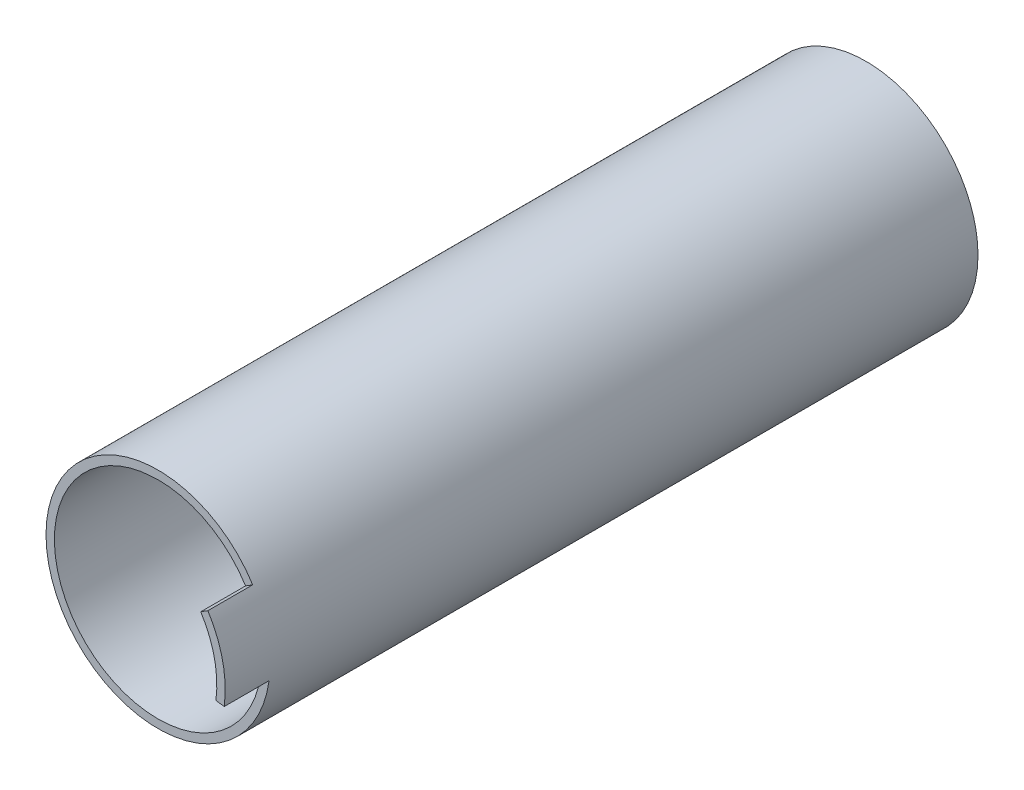
ISO-10303-21;
HEADER;
FILE_DESCRIPTION(('STEP AP214'),'2;1');
FILE_NAME('part.step','',(''),(''),'','','');
FILE_SCHEMA(('AUTOMOTIVE_DESIGN { 1 0 10303 214 1 1 1 1 }'));
ENDSEC;
DATA;
#1=APPLICATION_CONTEXT('core data for automotive mechanical design processes');
#2=APPLICATION_PROTOCOL_DEFINITION('international standard','automotive_design',2000,#1);
#3=PRODUCT_CONTEXT('',#1,'mechanical');
#4=PRODUCT('Part','Part','',(#3));
#5=PRODUCT_RELATED_PRODUCT_CATEGORY('part','',(#4));
#6=PRODUCT_DEFINITION_FORMATION('','',#4);
#7=PRODUCT_DEFINITION_CONTEXT('part definition',#1,'design');
#8=PRODUCT_DEFINITION('design','',#6,#7);
#9=PRODUCT_DEFINITION_SHAPE('','',#8);
#10=(LENGTH_UNIT() NAMED_UNIT(*) SI_UNIT(.MILLI.,.METRE.));
#11=(NAMED_UNIT(*) PLANE_ANGLE_UNIT() SI_UNIT($,.RADIAN.));
#12=(NAMED_UNIT(*) SI_UNIT($,.STERADIAN.) SOLID_ANGLE_UNIT());
#13=UNCERTAINTY_MEASURE_WITH_UNIT(LENGTH_MEASURE(1.E-05),#10,'distance_accuracy_value','');
#14=(GEOMETRIC_REPRESENTATION_CONTEXT(3) GLOBAL_UNCERTAINTY_ASSIGNED_CONTEXT((#13)) GLOBAL_UNIT_ASSIGNED_CONTEXT((#10,
#11,#12)) REPRESENTATION_CONTEXT('',''));
#15=CARTESIAN_POINT('',(0.,0.,0.));
#16=DIRECTION('',(0.,0.,1.));
#17=DIRECTION('',(1.,0.,0.));
#18=AXIS2_PLACEMENT_3D('',#15,#16,#17);
#19=CARTESIAN_POINT('',(0.,0.,0.));
#20=DIRECTION('',(0.,0.,-1.));
#21=DIRECTION('',(-1.,0.,0.));
#22=AXIS2_PLACEMENT_3D('',#19,#20,#21);
#23=PLANE('',#22);
#24=CARTESIAN_POINT('',(0.,0.,0.));
#25=DIRECTION('',(0.,0.,1.));
#26=DIRECTION('',(-1.,0.,0.));
#27=AXIS2_PLACEMENT_3D('',#24,#25,#26);
#28=CIRCLE('',#27,5.);
#29=CARTESIAN_POINT('',(-5.,0.,0.));
#30=VERTEX_POINT('',#29);
#31=CARTESIAN_POINT('',(5.,0.,0.));
#32=VERTEX_POINT('',#31);
#33=EDGE_CURVE('E104',#30,#32,#28,.T.);
#34=ORIENTED_EDGE('',*,*,#33,.F.);
#35=DIRECTION('',(0.,-1.,0.));
#36=VECTOR('',#35,1.);
#37=CARTESIAN_POINT('',(-5.,0.,0.));
#38=LINE('',#37,#36);
#39=CARTESIAN_POINT('',(-5.,16.7705098312484,0.));
#40=VERTEX_POINT('',#39);
#41=EDGE_CURVE('E58',#40,#30,#38,.T.);
#42=ORIENTED_EDGE('',*,*,#41,.F.);
#43=CARTESIAN_POINT('',(0.,0.,0.));
#44=DIRECTION('',(0.,0.,1.));
#45=DIRECTION('',(1.,0.,0.));
#46=AXIS2_PLACEMENT_3D('',#43,#44,#45);
#47=CIRCLE('',#46,17.5);
#48=CARTESIAN_POINT('',(5.,16.7705098312484,0.));
#49=VERTEX_POINT('',#48);
#50=EDGE_CURVE('E105',#49,#40,#47,.T.);
#51=ORIENTED_EDGE('',*,*,#50,.F.);
#52=DIRECTION('',(0.,1.,0.));
#53=VECTOR('',#52,1.);
#54=CARTESIAN_POINT('',(5.,0.,0.));
#55=LINE('',#54,#53);
#56=EDGE_CURVE('E94',#32,#49,#55,.T.);
#57=ORIENTED_EDGE('',*,*,#56,.F.);
#58=EDGE_LOOP('',(#34,#42,#51,#57));
#59=FACE_BOUND('',#58,.T.);
#60=CARTESIAN_POINT('',(0.,0.,0.));
#61=DIRECTION('',(0.,0.,1.));
#62=DIRECTION('',(1.,0.,0.));
#63=AXIS2_PLACEMENT_3D('',#60,#61,#62);
#64=CIRCLE('',#63,2.99999999999862);
#65=CARTESIAN_POINT('',(-2.99999999999862,0.,0.));
#66=VERTEX_POINT('',#65);
#67=EDGE_CURVE('E117',#66,#66,#64,.T.);
#68=ORIENTED_EDGE('',*,*,#67,.T.);
#69=EDGE_LOOP('',(#68));
#70=FACE_BOUND('',#69,.T.);
#71=ADVANCED_FACE('F49',(#59,#70),#23,.T.);
#72=CARTESIAN_POINT('',(0.,0.,83.6221445044903));
#73=DIRECTION('',(0.,0.,-1.));
#74=DIRECTION('',(-1.,0.,0.));
#75=AXIS2_PLACEMENT_3D('',#72,#73,#74);
#76=CYLINDRICAL_SURFACE('',#75,5.);
#77=DIRECTION('',(0.,0.,-1.));
#78=VECTOR('',#77,1.);
#79=CARTESIAN_POINT('',(5.,0.,83.6221445044903));
#80=LINE('',#79,#78);
#81=CARTESIAN_POINT('',(5.,0.,58.6));
#82=VERTEX_POINT('',#81);
#83=EDGE_CURVE('E91',#82,#32,#80,.T.);
#84=ORIENTED_EDGE('',*,*,#83,.F.);
#85=CARTESIAN_POINT('',(0.,0.,58.6));
#86=DIRECTION('',(0.,0.,-1.));
#87=DIRECTION('',(-1.,0.,0.));
#88=AXIS2_PLACEMENT_3D('',#85,#86,#87);
#89=CIRCLE('',#88,5.);
#90=CARTESIAN_POINT('',(-5.,0.,58.6));
#91=VERTEX_POINT('',#90);
#92=EDGE_CURVE('E66',#82,#91,#89,.T.);
#93=ORIENTED_EDGE('',*,*,#92,.T.);
#94=DIRECTION('',(0.,0.,-1.));
#95=VECTOR('',#94,1.);
#96=CARTESIAN_POINT('',(-5.,0.,83.6221445044903));
#97=LINE('',#96,#95);
#98=EDGE_CURVE('E110',#91,#30,#97,.T.);
#99=ORIENTED_EDGE('',*,*,#98,.T.);
#100=ORIENTED_EDGE('',*,*,#33,.T.);
#101=EDGE_LOOP('',(#84,#93,#99,#100));
#102=FACE_BOUND('',#101,.T.);
#103=ADVANCED_FACE('F108',(#102),#76,.T.);
#104=CARTESIAN_POINT('',(5.,0.,83.6221445044903));
#105=DIRECTION('',(-1.,0.,0.));
#106=DIRECTION('',(0.,-1.,0.));
#107=AXIS2_PLACEMENT_3D('',#104,#105,#106);
#108=PLANE('',#107);
#109=DIRECTION('',(0.,0.,-1.));
#110=VECTOR('',#109,1.);
#111=CARTESIAN_POINT('',(5.,16.7705098312484,83.6221445044903));
#112=LINE('',#111,#110);
#113=CARTESIAN_POINT('',(5.,16.7705098312484,58.6));
#114=VERTEX_POINT('',#113);
#115=EDGE_CURVE('E86',#114,#49,#112,.T.);
#116=ORIENTED_EDGE('',*,*,#115,.F.);
#117=DIRECTION('',(0.,-1.,0.));
#118=VECTOR('',#117,1.);
#119=CARTESIAN_POINT('',(5.,0.,58.6));
#120=LINE('',#119,#118);
#121=EDGE_CURVE('E96',#114,#82,#120,.T.);
#122=ORIENTED_EDGE('',*,*,#121,.T.);
#123=ORIENTED_EDGE('',*,*,#83,.T.);
#124=ORIENTED_EDGE('',*,*,#56,.T.);
#125=EDGE_LOOP('',(#116,#122,#123,#124));
#126=FACE_BOUND('',#125,.T.);
#127=ADVANCED_FACE('F93',(#126),#108,.F.);
#128=CARTESIAN_POINT('',(0.,0.,83.6221445044903));
#129=DIRECTION('',(0.,0.,-1.));
#130=DIRECTION('',(-1.,0.,0.));
#131=AXIS2_PLACEMENT_3D('',#128,#129,#130);
#132=CYLINDRICAL_SURFACE('',#131,17.5);
#133=DIRECTION('',(0.,0.,-1.));
#134=VECTOR('',#133,1.);
#135=CARTESIAN_POINT('',(-5.,16.7705098312484,83.6221445044903));
#136=LINE('',#135,#134);
#137=CARTESIAN_POINT('',(-5.,16.7705098312484,58.6));
#138=VERTEX_POINT('',#137);
#139=EDGE_CURVE('E121',#138,#40,#136,.T.);
#140=ORIENTED_EDGE('',*,*,#139,.F.);
#141=CARTESIAN_POINT('',(0.,0.,58.6));
#142=DIRECTION('',(0.,0.,-1.));
#143=DIRECTION('',(-1.,0.,0.));
#144=AXIS2_PLACEMENT_3D('',#141,#142,#143);
#145=CIRCLE('',#144,17.5);
#146=EDGE_CURVE('E106',#138,#114,#145,.T.);
#147=ORIENTED_EDGE('',*,*,#146,.T.);
#148=ORIENTED_EDGE('',*,*,#115,.T.);
#149=ORIENTED_EDGE('',*,*,#50,.T.);
#150=EDGE_LOOP('',(#140,#147,#148,#149));
#151=FACE_BOUND('',#150,.T.);
#152=ADVANCED_FACE('F130',(#151),#132,.T.);
#153=CARTESIAN_POINT('',(-5.,0.,83.6221445044903));
#154=DIRECTION('',(1.,0.,0.));
#155=DIRECTION('',(0.,1.,0.));
#156=AXIS2_PLACEMENT_3D('',#153,#154,#155);
#157=PLANE('',#156);
#158=ORIENTED_EDGE('',*,*,#98,.F.);
#159=DIRECTION('',(0.,1.,0.));
#160=VECTOR('',#159,1.);
#161=CARTESIAN_POINT('',(-5.,0.,58.6));
#162=LINE('',#161,#160);
#163=EDGE_CURVE('E122',#91,#138,#162,.T.);
#164=ORIENTED_EDGE('',*,*,#163,.T.);
#165=ORIENTED_EDGE('',*,*,#139,.T.);
#166=ORIENTED_EDGE('',*,*,#41,.T.);
#167=EDGE_LOOP('',(#158,#164,#165,#166));
#168=FACE_BOUND('',#167,.T.);
#169=ADVANCED_FACE('F129',(#168),#157,.F.);
#170=CARTESIAN_POINT('',(0.,0.,83.6221445044903));
#171=DIRECTION('',(0.,0.,-1.));
#172=DIRECTION('',(-1.,0.,0.));
#173=AXIS2_PLACEMENT_3D('',#170,#171,#172);
#174=CYLINDRICAL_SURFACE('',#173,2.99999999999862);
#175=CARTESIAN_POINT('',(0.,0.,58.6));
#176=DIRECTION('',(0.,0.,-1.));
#177=DIRECTION('',(-1.,0.,0.));
#178=AXIS2_PLACEMENT_3D('',#175,#176,#177);
#179=CIRCLE('',#178,2.99999999999862);
#180=CARTESIAN_POINT('',(-2.99999999999862,0.,58.6));
#181=VERTEX_POINT('',#180);
#182=EDGE_CURVE('E13',#181,#181,#179,.T.);
#183=CARTESIAN_POINT('',(-2.99999999999862,0.,58.6));
#184=CARTESIAN_POINT('',(-2.99999999999862,0.,57.9895833333333));
#185=CARTESIAN_POINT('',(-2.99999999999862,0.,57.3791666666667));
#186=CARTESIAN_POINT('',(-2.99999999999862,0.,56.1583333333333));
#187=CARTESIAN_POINT('',(-2.99999999999862,0.,55.5479166666667));
#188=CARTESIAN_POINT('',(-2.99999999999862,0.,54.3270833333333));
#189=CARTESIAN_POINT('',(-2.99999999999862,0.,53.7166666666667));
#190=CARTESIAN_POINT('',(-2.99999999999862,0.,52.4958333333333));
#191=CARTESIAN_POINT('',(-2.99999999999862,0.,51.8854166666667));
#192=CARTESIAN_POINT('',(-2.99999999999862,0.,50.6645833333333));
#193=CARTESIAN_POINT('',(-2.99999999999862,0.,50.0541666666667));
#194=CARTESIAN_POINT('',(-2.99999999999862,0.,48.8333333333333));
#195=CARTESIAN_POINT('',(-2.99999999999862,0.,48.2229166666667));
#196=CARTESIAN_POINT('',(-2.99999999999862,0.,47.0020833333333));
#197=CARTESIAN_POINT('',(-2.99999999999862,0.,46.3916666666667));
#198=CARTESIAN_POINT('',(-2.99999999999862,0.,45.1708333333333));
#199=CARTESIAN_POINT('',(-2.99999999999862,0.,44.5604166666667));
#200=CARTESIAN_POINT('',(-2.99999999999862,0.,43.3395833333333));
#201=CARTESIAN_POINT('',(-2.99999999999862,0.,42.7291666666667));
#202=CARTESIAN_POINT('',(-2.99999999999862,0.,41.5083333333333));
#203=CARTESIAN_POINT('',(-2.99999999999862,0.,40.8979166666667));
#204=CARTESIAN_POINT('',(-2.99999999999862,0.,39.6770833333333));
#205=CARTESIAN_POINT('',(-2.99999999999862,0.,39.0666666666667));
#206=CARTESIAN_POINT('',(-2.99999999999862,0.,37.8458333333333));
#207=CARTESIAN_POINT('',(-2.99999999999862,0.,37.2354166666667));
#208=CARTESIAN_POINT('',(-2.99999999999862,0.,36.0145833333333));
#209=CARTESIAN_POINT('',(-2.99999999999862,0.,35.4041666666667));
#210=CARTESIAN_POINT('',(-2.99999999999862,0.,34.1833333333333));
#211=CARTESIAN_POINT('',(-2.99999999999862,0.,33.5729166666667));
#212=CARTESIAN_POINT('',(-2.99999999999862,0.,32.3520833333333));
#213=CARTESIAN_POINT('',(-2.99999999999862,0.,31.7416666666667));
#214=CARTESIAN_POINT('',(-2.99999999999862,0.,30.5208333333333));
#215=CARTESIAN_POINT('',(-2.99999999999862,0.,29.9104166666667));
#216=CARTESIAN_POINT('',(-2.99999999999862,0.,28.6895833333333));
#217=CARTESIAN_POINT('',(-2.99999999999862,0.,28.0791666666667));
#218=CARTESIAN_POINT('',(-2.99999999999862,0.,26.8583333333333));
#219=CARTESIAN_POINT('',(-2.99999999999862,0.,26.2479166666667));
#220=CARTESIAN_POINT('',(-2.99999999999862,0.,25.0270833333333));
#221=CARTESIAN_POINT('',(-2.99999999999862,0.,24.4166666666667));
#222=CARTESIAN_POINT('',(-2.99999999999862,0.,23.1958333333333));
#223=CARTESIAN_POINT('',(-2.99999999999862,0.,22.5854166666667));
#224=CARTESIAN_POINT('',(-2.99999999999862,0.,21.3645833333333));
#225=CARTESIAN_POINT('',(-2.99999999999862,0.,20.7541666666667));
#226=CARTESIAN_POINT('',(-2.99999999999862,0.,19.5333333333333));
#227=CARTESIAN_POINT('',(-2.99999999999862,0.,18.9229166666667));
#228=CARTESIAN_POINT('',(-2.99999999999862,0.,17.7020833333333));
#229=CARTESIAN_POINT('',(-2.99999999999862,0.,17.0916666666667));
#230=CARTESIAN_POINT('',(-2.99999999999862,0.,15.8708333333333));
#231=CARTESIAN_POINT('',(-2.99999999999862,0.,15.2604166666667));
#232=CARTESIAN_POINT('',(-2.99999999999862,0.,14.0395833333333));
#233=CARTESIAN_POINT('',(-2.99999999999862,0.,13.4291666666667));
#234=CARTESIAN_POINT('',(-2.99999999999862,0.,12.2083333333333));
#235=CARTESIAN_POINT('',(-2.99999999999862,0.,11.5979166666667));
#236=CARTESIAN_POINT('',(-2.99999999999862,0.,10.3770833333333));
#237=CARTESIAN_POINT('',(-2.99999999999862,0.,9.76666666666666));
#238=CARTESIAN_POINT('',(-2.99999999999862,0.,8.54583333333332));
#239=CARTESIAN_POINT('',(-2.99999999999862,0.,7.93541666666665));
#240=CARTESIAN_POINT('',(-2.99999999999862,0.,6.71458333333332));
#241=CARTESIAN_POINT('',(-2.99999999999862,0.,6.10416666666666));
#242=CARTESIAN_POINT('',(-2.99999999999862,0.,4.88333333333332));
#243=CARTESIAN_POINT('',(-2.99999999999862,0.,4.27291666666665));
#244=CARTESIAN_POINT('',(-2.99999999999862,0.,3.05208333333332));
#245=CARTESIAN_POINT('',(-2.99999999999862,0.,2.44166666666666));
#246=CARTESIAN_POINT('',(-2.99999999999862,0.,1.22083333333332));
#247=CARTESIAN_POINT('',(-2.99999999999862,0.,0.610416666666655));
#248=CARTESIAN_POINT('',(-2.99999999999862,0.,0.));
#249=B_SPLINE_CURVE_WITH_KNOTS('',3,(#183,#184,#185,#186,#187,#188,#189,#190,#191,#192,#193,
#194,#195,#196,#197,#198,#199,#200,#201,#202,#203,#204,#205,#206,#207,#208,#209,#210,#211,#212,
#213,#214,#215,#216,#217,#218,#219,#220,#221,#222,#223,#224,#225,#226,#227,#228,#229,#230,#231,
#232,#233,#234,#235,#236,#237,#238,#239,#240,#241,#242,#243,#244,#245,#246,#247,#248),
.UNSPECIFIED.,.F.,.F.,(4,2,2,2,2,2,2,2,2,2,2,2,2,2,2,2,2,2,2,2,2,2,2,2,2,2,2,2,2,2,2,2,4),(0.,
1.83124999999999,3.6625,5.49375,7.325,9.15625,10.9875,12.81875,14.65,16.48125,18.3125,20.14375,
21.975,23.80625,25.6375,27.46875,29.3,31.13125,32.9625,34.79375,36.625,38.45625,40.2875,
42.11875,43.95,45.78125,47.6125,49.44375,51.275,53.10625,54.9375,56.76875,58.6),.UNSPECIFIED.);
#250=EDGE_CURVE('BSEAM132',#181,#66,#249,.T.);
#251=ORIENTED_EDGE('',*,*,#182,.F.);
#252=ORIENTED_EDGE('',*,*,#67,.F.);
#253=ORIENTED_EDGE('',*,*,#250,.T.);
#254=ORIENTED_EDGE('',*,*,#250,.F.);
#255=EDGE_LOOP('',(#251,#253,#252,#254));
#256=FACE_BOUND('',#255,.T.);
#257=ADVANCED_FACE('F132',(#256),#174,.F.);
#258=CARTESIAN_POINT('',(0.,-5.01335084557297E-13,58.6));
#259=DIRECTION('',(0.,0.,-1.));
#260=DIRECTION('',(-1.,0.,0.));
#261=AXIS2_PLACEMENT_3D('',#258,#259,#260);
#262=PLANE('',#261);
#263=ORIENTED_EDGE('',*,*,#182,.T.);
#264=EDGE_LOOP('',(#263));
#265=FACE_BOUND('',#264,.T.);
#266=ORIENTED_EDGE('',*,*,#121,.F.);
#267=ORIENTED_EDGE('',*,*,#146,.F.);
#268=ORIENTED_EDGE('',*,*,#163,.F.);
#269=ORIENTED_EDGE('',*,*,#92,.F.);
#270=EDGE_LOOP('',(#266,#267,#268,#269));
#271=FACE_BOUND('',#270,.T.);
#272=ADVANCED_FACE('F51',(#265,#271),#262,.F.);
#273=CLOSED_SHELL('',(#71,#103,#127,#152,#169,#257,#272));
#274=MANIFOLD_SOLID_BREP('B2',#273);
#275=CARTESIAN_POINT('',(-7.41124908692476,8.1285538056629,126.4));
#276=DIRECTION('',(0.,0.,-1.));
#277=DIRECTION('',(-1.,0.,0.));
#278=AXIS2_PLACEMENT_3D('',#275,#276,#277);
#279=CYLINDRICAL_SURFACE('',#278,6.);
#280=CARTESIAN_POINT('',(-7.41124908692476,8.1285538056629,67.4));
#281=DIRECTION('',(0.,0.,-1.));
#282=DIRECTION('',(-1.,0.,0.));
#283=AXIS2_PLACEMENT_3D('',#280,#281,#282);
#284=CIRCLE('',#283,6.);
#285=CARTESIAN_POINT('',(-1.49013878743609,9.09832327377844,67.4));
#286=VERTEX_POINT('',#285);
#287=CARTESIAN_POINT('',(-3.3687495849658,3.69479718439223,67.4));
#288=VERTEX_POINT('',#287);
#289=EDGE_CURVE('E319',#286,#288,#284,.T.);
#290=ORIENTED_EDGE('',*,*,#289,.F.);
#291=DIRECTION('',(0.,0.,-1.));
#292=VECTOR('',#291,1.);
#293=CARTESIAN_POINT('',(-1.49013878743609,9.09832327377844,126.4));
#294=LINE('',#293,#292);
#295=CARTESIAN_POINT('',(-1.49013878743609,9.09832327377844,59.));
#296=VERTEX_POINT('',#295);
#297=EDGE_CURVE('E352',#286,#296,#294,.T.);
#298=ORIENTED_EDGE('',*,*,#297,.T.);
#299=CARTESIAN_POINT('',(-7.41124908692476,8.1285538056629,59.));
#300=DIRECTION('',(0.,0.,-1.));
#301=DIRECTION('',(-1.,0.,0.));
#302=AXIS2_PLACEMENT_3D('',#299,#300,#301);
#303=CIRCLE('',#302,6.);
#304=CARTESIAN_POINT('',(-3.3687495849658,3.69479718439223,59.));
#305=VERTEX_POINT('',#304);
#306=EDGE_CURVE('E340',#296,#305,#303,.T.);
#307=ORIENTED_EDGE('',*,*,#306,.T.);
#308=DIRECTION('',(0.,0.,-1.));
#309=VECTOR('',#308,1.);
#310=CARTESIAN_POINT('',(-3.3687495849658,3.69479718439223,126.4));
#311=LINE('',#310,#309);
#312=EDGE_CURVE('E353',#288,#305,#311,.T.);
#313=ORIENTED_EDGE('',*,*,#312,.F.);
#314=EDGE_LOOP('',(#290,#298,#307,#313));
#315=FACE_BOUND('',#314,.T.);
#316=ADVANCED_FACE('F195',(#315),#279,.F.);
#317=CARTESIAN_POINT('',(0.,0.,126.4));
#318=DIRECTION('',(0.,0.,-1.));
#319=DIRECTION('',(-1.,0.,0.));
#320=AXIS2_PLACEMENT_3D('',#317,#318,#319);
#321=CYLINDRICAL_SURFACE('',#320,5.);
#322=CARTESIAN_POINT('',(0.,0.,67.4));
#323=DIRECTION('',(0.,0.,-1.));
#324=DIRECTION('',(-1.,0.,0.));
#325=AXIS2_PLACEMENT_3D('',#322,#323,#324);
#326=CIRCLE('',#325,5.);
#327=CARTESIAN_POINT('',(2.72727272727273,4.19070202604222,67.4));
#328=VERTEX_POINT('',#327);
#329=EDGE_CURVE('E321',#288,#328,#326,.F.);
#330=ORIENTED_EDGE('',*,*,#329,.F.);
#331=ORIENTED_EDGE('',*,*,#312,.T.);
#332=CARTESIAN_POINT('',(0.,0.,59.));
#333=DIRECTION('',(0.,0.,-1.));
#334=DIRECTION('',(-1.,0.,0.));
#335=AXIS2_PLACEMENT_3D('',#332,#333,#334);
#336=CIRCLE('',#335,5.);
#337=CARTESIAN_POINT('',(2.72727272727273,4.19070202604222,59.));
#338=VERTEX_POINT('',#337);
#339=EDGE_CURVE('E343',#305,#338,#336,.F.);
#340=ORIENTED_EDGE('',*,*,#339,.T.);
#341=DIRECTION('',(0.,0.,-1.));
#342=VECTOR('',#341,1.);
#343=CARTESIAN_POINT('',(2.72727272727273,4.19070202604222,126.4));
#344=LINE('',#343,#342);
#345=EDGE_CURVE('E356',#328,#338,#344,.T.);
#346=ORIENTED_EDGE('',*,*,#345,.F.);
#347=EDGE_LOOP('',(#330,#331,#340,#346));
#348=FACE_BOUND('',#347,.T.);
#349=ADVANCED_FACE('F409',(#348),#321,.T.);
#350=CARTESIAN_POINT('',(6.,9.21954445729289,126.4));
#351=DIRECTION('',(0.,0.,-1.));
#352=DIRECTION('',(-1.,0.,0.));
#353=AXIS2_PLACEMENT_3D('',#350,#351,#352);
#354=CYLINDRICAL_SURFACE('',#353,6.);
#355=CARTESIAN_POINT('',(6.,9.21954445729289,67.4));
#356=DIRECTION('',(0.,0.,-1.));
#357=DIRECTION('',(-1.,0.,0.));
#358=AXIS2_PLACEMENT_3D('',#355,#356,#357);
#359=CIRCLE('',#358,6.);
#360=CARTESIAN_POINT('',(0.,9.21954445729289,67.4));
#361=VERTEX_POINT('',#360);
#362=EDGE_CURVE('E323',#328,#361,#359,.T.);
#363=ORIENTED_EDGE('',*,*,#362,.F.);
#364=ORIENTED_EDGE('',*,*,#345,.T.);
#365=CARTESIAN_POINT('',(6.,9.21954445729289,59.));
#366=DIRECTION('',(0.,0.,-1.));
#367=DIRECTION('',(-1.,0.,0.));
#368=AXIS2_PLACEMENT_3D('',#365,#366,#367);
#369=CIRCLE('',#368,6.);
#370=CARTESIAN_POINT('',(0.,9.21954445729289,59.));
#371=VERTEX_POINT('',#370);
#372=EDGE_CURVE('E346',#338,#371,#369,.T.);
#373=ORIENTED_EDGE('',*,*,#372,.T.);
#374=DIRECTION('',(0.,0.,-1.));
#375=VECTOR('',#374,1.);
#376=CARTESIAN_POINT('',(0.,9.21954445729289,126.4));
#377=LINE('',#376,#375);
#378=EDGE_CURVE('E358',#361,#371,#377,.T.);
#379=ORIENTED_EDGE('',*,*,#378,.F.);
#380=EDGE_LOOP('',(#363,#364,#373,#379));
#381=FACE_BOUND('',#380,.T.);
#382=ADVANCED_FACE('F404',(#381),#354,.F.);
#383=CARTESIAN_POINT('',(0.,18.5,126.4));
#384=DIRECTION('',(1.,0.,0.));
#385=DIRECTION('',(0.,1.,0.));
#386=AXIS2_PLACEMENT_3D('',#383,#384,#385);
#387=PLANE('',#386);
#388=DIRECTION('',(0.,1.,0.));
#389=VECTOR('',#388,1.);
#390=CARTESIAN_POINT('',(0.,18.5,67.4));
#391=LINE('',#390,#389);
#392=CARTESIAN_POINT('',(0.,18.5,67.4));
#393=VERTEX_POINT('',#392);
#394=EDGE_CURVE('E325',#361,#393,#391,.T.);
#395=ORIENTED_EDGE('',*,*,#394,.F.);
#396=ORIENTED_EDGE('',*,*,#378,.T.);
#397=DIRECTION('',(0.,1.,0.));
#398=VECTOR('',#397,1.);
#399=CARTESIAN_POINT('',(0.,18.5,59.));
#400=LINE('',#399,#398);
#401=CARTESIAN_POINT('',(0.,18.5,59.));
#402=VERTEX_POINT('',#401);
#403=EDGE_CURVE('E349',#371,#402,#400,.T.);
#404=ORIENTED_EDGE('',*,*,#403,.T.);
#405=DIRECTION('',(0.,0.,-1.));
#406=VECTOR('',#405,1.);
#407=CARTESIAN_POINT('',(0.,18.5,126.4));
#408=LINE('',#407,#406);
#409=EDGE_CURVE('E363',#393,#402,#408,.T.);
#410=ORIENTED_EDGE('',*,*,#409,.F.);
#411=EDGE_LOOP('',(#395,#396,#404,#410));
#412=FACE_BOUND('',#411,.T.);
#413=ADVANCED_FACE('F400',(#412),#387,.T.);
#414=CARTESIAN_POINT('',(-2.99012252668958,18.2567567567568,126.4));
#415=DIRECTION('',(-0.986851716581446,-0.161628244685923,0.));
#416=DIRECTION('',(0.161628244685923,-0.986851716581447,0.));
#417=AXIS2_PLACEMENT_3D('',#414,#415,#416);
#418=PLANE('',#417);
#419=DIRECTION('',(0.161628244685923,-0.986851716581447,0.));
#420=VECTOR('',#419,1.);
#421=CARTESIAN_POINT('',(-2.99012252668958,18.2567567567568,67.4));
#422=LINE('',#421,#420);
#423=CARTESIAN_POINT('',(-2.99012252668958,18.2567567567568,67.4));
#424=VERTEX_POINT('',#423);
#425=EDGE_CURVE('E317',#424,#286,#422,.T.);
#426=ORIENTED_EDGE('',*,*,#425,.F.);
#427=DIRECTION('',(0.,0.,-1.));
#428=VECTOR('',#427,1.);
#429=CARTESIAN_POINT('',(-2.99012252668958,18.2567567567568,126.4));
#430=LINE('',#429,#428);
#431=CARTESIAN_POINT('',(-2.99012252668958,18.2567567567568,59.));
#432=VERTEX_POINT('',#431);
#433=EDGE_CURVE('E366',#424,#432,#430,.T.);
#434=ORIENTED_EDGE('',*,*,#433,.T.);
#435=DIRECTION('',(0.161628244685923,-0.986851716581447,0.));
#436=VECTOR('',#435,1.);
#437=CARTESIAN_POINT('',(-2.99012252668958,18.2567567567568,59.));
#438=LINE('',#437,#436);
#439=EDGE_CURVE('E337',#432,#296,#438,.T.);
#440=ORIENTED_EDGE('',*,*,#439,.T.);
#441=ORIENTED_EDGE('',*,*,#297,.F.);
#442=EDGE_LOOP('',(#426,#434,#440,#441));
#443=FACE_BOUND('',#442,.T.);
#444=ADVANCED_FACE('F416',(#443),#418,.T.);
#445=CARTESIAN_POINT('',(0.,0.,126.4));
#446=DIRECTION('',(0.,0.,-1.));
#447=DIRECTION('',(-1.,0.,0.));
#448=AXIS2_PLACEMENT_3D('',#445,#446,#447);
#449=CYLINDRICAL_SURFACE('',#448,3.);
#450=CARTESIAN_POINT('',(0.,0.,67.4));
#451=DIRECTION('',(0.,0.,-1.));
#452=DIRECTION('',(-1.,0.,0.));
#453=AXIS2_PLACEMENT_3D('',#450,#451,#452);
#454=CIRCLE('',#453,3.);
#455=CARTESIAN_POINT('',(-3.,0.,67.4));
#456=VERTEX_POINT('',#455);
#457=EDGE_CURVE('E313',#456,#456,#454,.F.);
#458=ORIENTED_EDGE('',*,*,#457,.T.);
#459=EDGE_LOOP('',(#458));
#460=FACE_BOUND('',#459,.T.);
#461=CARTESIAN_POINT('',(0.,0.,59.));
#462=DIRECTION('',(0.,0.,-1.));
#463=DIRECTION('',(-1.,0.,0.));
#464=AXIS2_PLACEMENT_3D('',#461,#462,#463);
#465=CIRCLE('',#464,3.);
#466=CARTESIAN_POINT('',(-3.,0.,59.));
#467=VERTEX_POINT('',#466);
#468=EDGE_CURVE('E199',#467,#467,#465,.F.);
#469=ORIENTED_EDGE('',*,*,#468,.F.);
#470=EDGE_LOOP('',(#469));
#471=FACE_BOUND('',#470,.T.);
#472=ADVANCED_FACE('F441',(#460,#471),#449,.F.);
#473=CARTESIAN_POINT('',(0.,0.,126.4));
#474=DIRECTION('',(0.,0.,1.));
#475=DIRECTION('',(1.,0.,0.));
#476=AXIS2_PLACEMENT_3D('',#473,#474,#475);
#477=PLANE('',#476);
#478=DIRECTION('',(0.991029909341494,-0.133640258869065,0.));
#479=VECTOR('',#478,1.);
#480=CARTESIAN_POINT('',(19.8205981868299,-2.6728051773813,126.4));
#481=LINE('',#480,#479);
#482=CARTESIAN_POINT('',(18.3340533228176,-2.4723447890777,126.4));
#483=VERTEX_POINT('',#482);
#484=CARTESIAN_POINT('',(19.8205981868299,-2.6728051773813,126.4));
#485=VERTEX_POINT('',#484);
#486=EDGE_CURVE('E301',#483,#485,#481,.T.);
#487=ORIENTED_EDGE('',*,*,#486,.F.);
#488=CARTESIAN_POINT('',(0.,0.,126.4));
#489=DIRECTION('',(0.,0.,1.));
#490=DIRECTION('',(1.,0.,0.));
#491=AXIS2_PLACEMENT_3D('',#488,#489,#490);
#492=CIRCLE('',#491,18.5);
#493=CARTESIAN_POINT('',(-2.99012252668958,18.2567567567568,126.4));
#494=VERTEX_POINT('',#493);
#495=EDGE_CURVE('E368',#494,#483,#492,.T.);
#496=ORIENTED_EDGE('',*,*,#495,.F.);
#497=DIRECTION('',(-0.996707508896528,-0.0810810810810807,0.));
#498=VECTOR('',#497,1.);
#499=CARTESIAN_POINT('',(0.,18.5,126.4));
#500=LINE('',#499,#498);
#501=CARTESIAN_POINT('',(0.,18.5,126.4));
#502=VERTEX_POINT('',#501);
#503=EDGE_CURVE('E304',#502,#494,#500,.T.);
#504=ORIENTED_EDGE('',*,*,#503,.F.);
#505=CARTESIAN_POINT('',(15.6338922650837,9.89097632409239,126.4));
#506=VERTEX_POINT('',#505);
#507=EDGE_CURVE('E371',#506,#502,#492,.T.);
#508=ORIENTED_EDGE('',*,*,#507,.F.);
#509=DIRECTION('',(-0.845075257572092,-0.534647368869859,0.));
#510=VECTOR('',#509,1.);
#511=CARTESIAN_POINT('',(16.9015051514418,10.6929473773972,126.4));
#512=LINE('',#511,#510);
#513=CARTESIAN_POINT('',(16.9015051514418,10.6929473773972,126.4));
#514=VERTEX_POINT('',#513);
#515=EDGE_CURVE('E215',#514,#506,#512,.T.);
#516=ORIENTED_EDGE('',*,*,#515,.F.);
#517=CARTESIAN_POINT('',(0.,0.,126.4));
#518=DIRECTION('',(0.,0.,1.));
#519=DIRECTION('',(1.,0.,0.));
#520=AXIS2_PLACEMENT_3D('',#517,#518,#519);
#521=CIRCLE('',#520,20.);
#522=EDGE_CURVE('E47',#514,#485,#521,.T.);
#523=ORIENTED_EDGE('',*,*,#522,.T.);
#524=EDGE_LOOP('',(#487,#496,#504,#508,#516,#523));
#525=FACE_BOUND('',#524,.T.);
#526=ADVANCED_FACE('F379',(#525),#477,.T.);
#527=CARTESIAN_POINT('',(0.,0.,0.));
#528=DIRECTION('',(0.,0.,1.));
#529=DIRECTION('',(1.,0.,0.));
#530=AXIS2_PLACEMENT_3D('',#527,#528,#529);
#531=PLANE('',#530);
#532=CARTESIAN_POINT('',(0.,0.,0.));
#533=DIRECTION('',(0.,0.,1.));
#534=DIRECTION('',(1.,0.,0.));
#535=AXIS2_PLACEMENT_3D('',#532,#533,#534);
#536=CIRCLE('',#535,20.);
#537=CARTESIAN_POINT('',(20.,0.,0.));
#538=VERTEX_POINT('',#537);
#539=EDGE_CURVE('E204',#538,#538,#536,.T.);
#540=ORIENTED_EDGE('',*,*,#539,.F.);
#541=EDGE_LOOP('',(#540));
#542=FACE_BOUND('',#541,.T.);
#543=CARTESIAN_POINT('',(0.,0.,0.));
#544=DIRECTION('',(0.,0.,1.));
#545=DIRECTION('',(1.,0.,0.));
#546=AXIS2_PLACEMENT_3D('',#543,#544,#545);
#547=CIRCLE('',#546,18.5);
#548=CARTESIAN_POINT('',(-2.99012252668958,18.2567567567568,0.));
#549=VERTEX_POINT('',#548);
#550=CARTESIAN_POINT('',(0.,18.5,0.));
#551=VERTEX_POINT('',#550);
#552=EDGE_CURVE('E355',#549,#551,#547,.T.);
#553=ORIENTED_EDGE('',*,*,#552,.T.);
#554=DIRECTION('',(0.996707508896528,0.0810810810810807,0.));
#555=VECTOR('',#554,1.);
#556=CARTESIAN_POINT('',(0.,18.5,0.));
#557=LINE('',#556,#555);
#558=EDGE_CURVE('E327',#549,#551,#557,.T.);
#559=ORIENTED_EDGE('',*,*,#558,.F.);
#560=EDGE_LOOP('',(#553,#559));
#561=FACE_BOUND('',#560,.T.);
#562=ADVANCED_FACE('F376',(#542,#561),#531,.F.);
#563=CARTESIAN_POINT('',(0.,0.,126.4));
#564=DIRECTION('',(0.,0.,-1.));
#565=DIRECTION('',(-1.,0.,0.));
#566=AXIS2_PLACEMENT_3D('',#563,#564,#565);
#567=CYLINDRICAL_SURFACE('',#566,20.);
#568=ORIENTED_EDGE('',*,*,#522,.F.);
#569=DIRECTION('',(0.,0.,-1.));
#570=VECTOR('',#569,1.);
#571=CARTESIAN_POINT('',(16.9015051514418,10.6929473773972,134.4));
#572=LINE('',#571,#570);
#573=CARTESIAN_POINT('',(16.9015051514418,10.6929473773972,134.4));
#574=VERTEX_POINT('',#573);
#575=EDGE_CURVE('E286',#574,#514,#572,.T.);
#576=ORIENTED_EDGE('',*,*,#575,.F.);
#577=CARTESIAN_POINT('',(0.,0.,134.4));
#578=DIRECTION('',(0.,0.,1.));
#579=DIRECTION('',(-1.,0.,0.));
#580=AXIS2_PLACEMENT_3D('',#577,#578,#579);
#581=CIRCLE('',#580,20.);
#582=CARTESIAN_POINT('',(19.8205981868299,-2.6728051773813,134.4));
#583=VERTEX_POINT('',#582);
#584=EDGE_CURVE('E292',#583,#574,#581,.T.);
#585=ORIENTED_EDGE('',*,*,#584,.F.);
#586=DIRECTION('',(0.,0.,-1.));
#587=VECTOR('',#586,1.);
#588=CARTESIAN_POINT('',(19.8205981868299,-2.6728051773813,134.4));
#589=LINE('',#588,#587);
#590=EDGE_CURVE('E429',#583,#485,#589,.T.);
#591=ORIENTED_EDGE('',*,*,#590,.T.);
#592=EDGE_LOOP('',(#568,#576,#585,#591));
#593=FACE_BOUND('',#592,.T.);
#594=ORIENTED_EDGE('',*,*,#539,.T.);
#595=EDGE_LOOP('',(#594));
#596=FACE_BOUND('',#595,.T.);
#597=ADVANCED_FACE('F197',(#593,#596),#567,.T.);
#598=CARTESIAN_POINT('',(0.,0.,126.4));
#599=DIRECTION('',(0.,0.,-1.));
#600=DIRECTION('',(-1.,0.,0.));
#601=AXIS2_PLACEMENT_3D('',#598,#599,#600);
#602=CYLINDRICAL_SURFACE('',#601,18.5);
#603=ORIENTED_EDGE('',*,*,#433,.F.);
#604=EDGE_CURVE('E364',#494,#424,#430,.T.);
#605=ORIENTED_EDGE('',*,*,#604,.F.);
#606=ORIENTED_EDGE('',*,*,#495,.T.);
#607=DIRECTION('',(0.,0.,-1.));
#608=VECTOR('',#607,1.);
#609=CARTESIAN_POINT('',(18.3340533228176,-2.4723447890777,134.4));
#610=LINE('',#609,#608);
#611=CARTESIAN_POINT('',(18.3340533228176,-2.4723447890777,134.4));
#612=VERTEX_POINT('',#611);
#613=EDGE_CURVE('E308',#612,#483,#610,.T.);
#614=ORIENTED_EDGE('',*,*,#613,.F.);
#615=CARTESIAN_POINT('',(0.,0.,134.4));
#616=DIRECTION('',(0.,0.,-1.));
#617=DIRECTION('',(-1.,0.,0.));
#618=AXIS2_PLACEMENT_3D('',#615,#616,#617);
#619=CIRCLE('',#618,18.5);
#620=CARTESIAN_POINT('',(15.6338922650837,9.89097632409239,134.4));
#621=VERTEX_POINT('',#620);
#622=EDGE_CURVE('E291',#621,#612,#619,.T.);
#623=ORIENTED_EDGE('',*,*,#622,.F.);
#624=DIRECTION('',(0.,0.,-1.));
#625=VECTOR('',#624,1.);
#626=CARTESIAN_POINT('',(15.6338922650837,9.89097632409239,134.4));
#627=LINE('',#626,#625);
#628=EDGE_CURVE('E288',#621,#506,#627,.T.);
#629=ORIENTED_EDGE('',*,*,#628,.T.);
#630=ORIENTED_EDGE('',*,*,#507,.T.);
#631=EDGE_CURVE('E360',#502,#393,#408,.T.);
#632=ORIENTED_EDGE('',*,*,#631,.T.);
#633=ORIENTED_EDGE('',*,*,#409,.T.);
#634=DIRECTION('',(0.,0.,-1.));
#635=VECTOR('',#634,1.);
#636=CARTESIAN_POINT('',(0.,18.5,59.));
#637=LINE('',#636,#635);
#638=EDGE_CURVE('E333',#402,#551,#637,.T.);
#639=ORIENTED_EDGE('',*,*,#638,.T.);
#640=ORIENTED_EDGE('',*,*,#552,.F.);
#641=DIRECTION('',(0.,0.,-1.));
#642=VECTOR('',#641,1.);
#643=CARTESIAN_POINT('',(-2.99012252668958,18.2567567567568,59.));
#644=LINE('',#643,#642);
#645=EDGE_CURVE('E331',#432,#549,#644,.T.);
#646=ORIENTED_EDGE('',*,*,#645,.F.);
#647=EDGE_LOOP('',(#603,#605,#606,#614,#623,#629,#630,#632,#633,#639,#640,#646));
#648=FACE_BOUND('',#647,.T.);
#649=ADVANCED_FACE('F385',(#648),#602,.F.);
#650=CARTESIAN_POINT('',(0.,-5.01335084557297E-13,59.));
#651=DIRECTION('',(0.,0.,-1.));
#652=DIRECTION('',(-1.,0.,0.));
#653=AXIS2_PLACEMENT_3D('',#650,#651,#652);
#654=PLANE('',#653);
#655=ORIENTED_EDGE('',*,*,#372,.F.);
#656=ORIENTED_EDGE('',*,*,#339,.F.);
#657=ORIENTED_EDGE('',*,*,#306,.F.);
#658=ORIENTED_EDGE('',*,*,#439,.F.);
#659=DIRECTION('',(0.996707508896528,0.0810810810810807,0.));
#660=VECTOR('',#659,1.);
#661=CARTESIAN_POINT('',(0.,18.5,59.));
#662=LINE('',#661,#660);
#663=EDGE_CURVE('E328',#432,#402,#662,.T.);
#664=ORIENTED_EDGE('',*,*,#663,.T.);
#665=ORIENTED_EDGE('',*,*,#403,.F.);
#666=EDGE_LOOP('',(#655,#656,#657,#658,#664,#665));
#667=FACE_BOUND('',#666,.T.);
#668=ORIENTED_EDGE('',*,*,#468,.T.);
#669=EDGE_LOOP('',(#668));
#670=FACE_BOUND('',#669,.T.);
#671=ADVANCED_FACE('F395',(#667,#670),#654,.T.);
#672=CARTESIAN_POINT('',(0.,18.5,59.));
#673=DIRECTION('',(-0.0810810810810807,0.996707508896528,0.));
#674=DIRECTION('',(-0.996707508896528,-0.0810810810810807,0.));
#675=AXIS2_PLACEMENT_3D('',#672,#673,#674);
#676=PLANE('',#675);
#677=ORIENTED_EDGE('',*,*,#558,.T.);
#678=ORIENTED_EDGE('',*,*,#638,.F.);
#679=ORIENTED_EDGE('',*,*,#663,.F.);
#680=ORIENTED_EDGE('',*,*,#645,.T.);
#681=EDGE_LOOP('',(#677,#678,#679,#680));
#682=FACE_BOUND('',#681,.T.);
#683=ADVANCED_FACE('F390',(#682),#676,.F.);
#684=CARTESIAN_POINT('',(2.05508176448488E-07,-2.52625562309483E-06,67.4));
#685=DIRECTION('',(0.,0.,-1.));
#686=DIRECTION('',(-1.,0.,0.));
#687=AXIS2_PLACEMENT_3D('',#684,#685,#686);
#688=PLANE('',#687);
#689=ORIENTED_EDGE('',*,*,#394,.T.);
#690=DIRECTION('',(-0.996707508896528,-0.0810810810810807,0.));
#691=VECTOR('',#690,1.);
#692=CARTESIAN_POINT('',(0.,18.5,67.4));
#693=LINE('',#692,#691);
#694=EDGE_CURVE('E306',#393,#424,#693,.T.);
#695=ORIENTED_EDGE('',*,*,#694,.T.);
#696=ORIENTED_EDGE('',*,*,#425,.T.);
#697=ORIENTED_EDGE('',*,*,#289,.T.);
#698=ORIENTED_EDGE('',*,*,#329,.T.);
#699=ORIENTED_EDGE('',*,*,#362,.T.);
#700=EDGE_LOOP('',(#689,#695,#696,#697,#698,#699));
#701=FACE_BOUND('',#700,.T.);
#702=ORIENTED_EDGE('',*,*,#457,.F.);
#703=EDGE_LOOP('',(#702));
#704=FACE_BOUND('',#703,.T.);
#705=ADVANCED_FACE('F435',(#701,#704),#688,.F.);
#706=CARTESIAN_POINT('',(0.,18.5,67.4));
#707=DIRECTION('',(-0.0810810810810807,0.996707508896528,0.));
#708=DIRECTION('',(-0.996707508896528,-0.0810810810810807,0.));
#709=AXIS2_PLACEMENT_3D('',#706,#707,#708);
#710=PLANE('',#709);
#711=ORIENTED_EDGE('',*,*,#503,.T.);
#712=ORIENTED_EDGE('',*,*,#604,.T.);
#713=ORIENTED_EDGE('',*,*,#694,.F.);
#714=ORIENTED_EDGE('',*,*,#631,.F.);
#715=EDGE_LOOP('',(#711,#712,#713,#714));
#716=FACE_BOUND('',#715,.T.);
#717=ADVANCED_FACE('F433',(#716),#710,.F.);
#718=CARTESIAN_POINT('',(16.9015051514418,10.6929473773972,134.4));
#719=DIRECTION('',(0.534647368869858,-0.845075257572092,0.));
#720=DIRECTION('',(0.845075257572092,0.534647368869858,0.));
#721=AXIS2_PLACEMENT_3D('',#718,#719,#720);
#722=PLANE('',#721);
#723=ORIENTED_EDGE('',*,*,#515,.T.);
#724=ORIENTED_EDGE('',*,*,#628,.F.);
#725=DIRECTION('',(-0.845075257572092,-0.534647368869859,0.));
#726=VECTOR('',#725,1.);
#727=CARTESIAN_POINT('',(16.9015051514418,10.6929473773972,134.4));
#728=LINE('',#727,#726);
#729=EDGE_CURVE('E282',#574,#621,#728,.T.);
#730=ORIENTED_EDGE('',*,*,#729,.F.);
#731=ORIENTED_EDGE('',*,*,#575,.T.);
#732=EDGE_LOOP('',(#723,#724,#730,#731));
#733=FACE_BOUND('',#732,.T.);
#734=ADVANCED_FACE('F284',(#733),#722,.F.);
#735=CARTESIAN_POINT('',(19.8205981868299,-2.6728051773813,134.4));
#736=DIRECTION('',(0.133640258869065,0.991029909341494,0.));
#737=DIRECTION('',(-0.991029909341494,0.133640258869065,0.));
#738=AXIS2_PLACEMENT_3D('',#735,#736,#737);
#739=PLANE('',#738);
#740=ORIENTED_EDGE('',*,*,#486,.T.);
#741=ORIENTED_EDGE('',*,*,#590,.F.);
#742=DIRECTION('',(0.991029909341494,-0.133640258869065,0.));
#743=VECTOR('',#742,1.);
#744=CARTESIAN_POINT('',(19.8205981868299,-2.6728051773813,134.4));
#745=LINE('',#744,#743);
#746=EDGE_CURVE('E297',#612,#583,#745,.T.);
#747=ORIENTED_EDGE('',*,*,#746,.F.);
#748=ORIENTED_EDGE('',*,*,#613,.T.);
#749=EDGE_LOOP('',(#740,#741,#747,#748));
#750=FACE_BOUND('',#749,.T.);
#751=ADVANCED_FACE('F430',(#750),#739,.F.);
#752=CARTESIAN_POINT('',(0.,0.,134.4));
#753=DIRECTION('',(0.,0.,-1.));
#754=DIRECTION('',(-1.,0.,0.));
#755=AXIS2_PLACEMENT_3D('',#752,#753,#754);
#756=PLANE('',#755);
#757=ORIENTED_EDGE('',*,*,#584,.T.);
#758=ORIENTED_EDGE('',*,*,#729,.T.);
#759=ORIENTED_EDGE('',*,*,#622,.T.);
#760=ORIENTED_EDGE('',*,*,#746,.T.);
#761=EDGE_LOOP('',(#757,#758,#759,#760));
#762=FACE_BOUND('',#761,.T.);
#763=ADVANCED_FACE('F295',(#762),#756,.F.);
#764=CLOSED_SHELL('',(#316,#349,#382,#413,#444,#472,#526,#562,#597,#649,#671,#683,#705,#717,
#734,#751,#763));
#765=MANIFOLD_SOLID_BREP('B7',#764);
#766=ADVANCED_BREP_SHAPE_REPRESENTATION('',(#18,#274,#765),#14);
#767=SHAPE_DEFINITION_REPRESENTATION(#9,#766);
ENDSEC;
END-ISO-10303-21;
